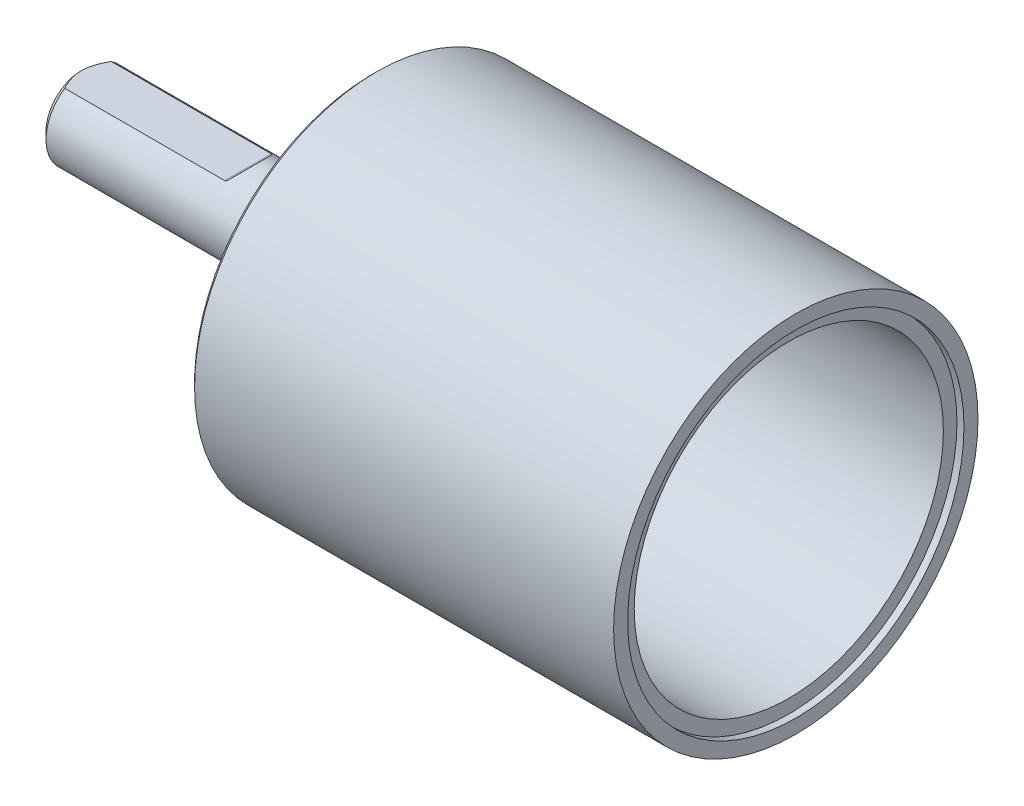
ISO-10303-21;
HEADER;
FILE_DESCRIPTION(('STEP AP214'),'2;1');
FILE_NAME('part.step','',(''),(''),'','','');
FILE_SCHEMA(('AUTOMOTIVE_DESIGN { 1 0 10303 214 1 1 1 1 }'));
ENDSEC;
DATA;
#1=APPLICATION_CONTEXT('core data for automotive mechanical design processes');
#2=APPLICATION_PROTOCOL_DEFINITION('international standard','automotive_design',2000,#1);
#3=PRODUCT_CONTEXT('',#1,'mechanical');
#4=PRODUCT('Part','Part','',(#3));
#5=PRODUCT_RELATED_PRODUCT_CATEGORY('part','',(#4));
#6=PRODUCT_DEFINITION_FORMATION('','',#4);
#7=PRODUCT_DEFINITION_CONTEXT('part definition',#1,'design');
#8=PRODUCT_DEFINITION('design','',#6,#7);
#9=PRODUCT_DEFINITION_SHAPE('','',#8);
#10=(LENGTH_UNIT() NAMED_UNIT(*) SI_UNIT(.MILLI.,.METRE.));
#11=(NAMED_UNIT(*) PLANE_ANGLE_UNIT() SI_UNIT($,.RADIAN.));
#12=(NAMED_UNIT(*) SI_UNIT($,.STERADIAN.) SOLID_ANGLE_UNIT());
#13=UNCERTAINTY_MEASURE_WITH_UNIT(LENGTH_MEASURE(1.E-05),#10,'distance_accuracy_value','');
#14=(GEOMETRIC_REPRESENTATION_CONTEXT(3) GLOBAL_UNCERTAINTY_ASSIGNED_CONTEXT((#13)) GLOBAL_UNIT_ASSIGNED_CONTEXT((#10,
#11,#12)) REPRESENTATION_CONTEXT('',''));
#15=CARTESIAN_POINT('',(0.,0.,0.));
#16=DIRECTION('',(0.,0.,1.));
#17=DIRECTION('',(1.,0.,0.));
#18=AXIS2_PLACEMENT_3D('',#15,#16,#17);
#19=CARTESIAN_POINT('',(-8.903553390593,2.75,1.760148926151));
#20=DIRECTION('',(0.,0.,-1.));
#21=DIRECTION('',(-1.,0.,0.));
#22=AXIS2_PLACEMENT_3D('',#19,#20,#21);
#23=CYLINDRICAL_SURFACE('',#22,0.25);
#24=DIRECTION('',(0.,0.,-1.));
#25=VECTOR('',#24,1.);
#26=CARTESIAN_POINT('',(-8.903553390593,2.5,-2.));
#27=LINE('',#26,#25);
#28=CARTESIAN_POINT('',(-8.903553390593,2.50000000000134,-1.65831239517366));
#29=VERTEX_POINT('',#28);
#30=CARTESIAN_POINT('',(-8.903553390593,2.49999999999998,1.65831239517774));
#31=VERTEX_POINT('',#30);
#32=EDGE_CURVE('E171',#29,#31,#27,.F.);
#33=ORIENTED_EDGE('',*,*,#32,.T.);
#34=CARTESIAN_POINT('',(-8.72677669529666,2.57322330470306,1.54224570809358));
#35=CARTESIAN_POINT('',(-8.73439985939467,2.56563624302275,1.55491918280179));
#36=CARTESIAN_POINT('',(-8.74289649208612,2.55809251140695,1.56727898662072));
#37=CARTESIAN_POINT('',(-8.76210852169711,2.5434922600164,1.59085851720834));
#38=CARTESIAN_POINT('',(-8.77285794877788,2.53644573210833,1.60205628000291));
#39=CARTESIAN_POINT('',(-8.79208402009963,2.52607708375026,1.61832921183312));
#40=CARTESIAN_POINT('',(-8.79977967658202,2.52238371853123,1.62407499191912));
#41=CARTESIAN_POINT('',(-8.81607913012841,2.51563769423967,1.63450449227761));
#42=CARTESIAN_POINT('',(-8.8246786883985,2.51258222906478,1.63919287166735));
#43=CARTESIAN_POINT('',(-8.84122182883245,2.50776865197646,1.6465456428268));
#44=CARTESIAN_POINT('',(-8.84903391565749,2.50587894599226,1.64941753453929));
#45=CARTESIAN_POINT('',(-8.8651228646061,2.50283671773988,1.65403027171102));
#46=CARTESIAN_POINT('',(-8.87339893829248,2.50168298383188,1.6557729762398));
#47=CARTESIAN_POINT('',(-8.88538609137744,2.50063457326736,1.65735542278128));
#48=CARTESIAN_POINT('',(-8.88900600754827,2.50039713273376,1.65771357331458));
#49=CARTESIAN_POINT('',(-8.89626777107055,2.50007977470023,1.65819214007039));
#50=CARTESIAN_POINT('',(-8.89990961485515,2.49999983224014,1.65831259396288));
#51=CARTESIAN_POINT('',(-8.90355339059295,2.49999999999995,1.65831239517805));
#52=B_SPLINE_CURVE_WITH_KNOTS('',3,(#34,#35,#36,#37,#38,#39,#40,#41,#42,#43,#44,#45,#46,#47,#48,
#49,#50,#51),.UNSPECIFIED.,.F.,.F.,(4,2,2,2,2,2,2,2,4),(0.,0.0500719921748423,0.100963298853683,
0.131739799136459,0.162377920913796,0.187882780738308,0.213345542491064,0.224272008855203,
0.235196743463227),.UNSPECIFIED.);
#53=CARTESIAN_POINT('',(-8.72677669529675,2.57322330470311,1.54224570809349));
#54=VERTEX_POINT('',#53);
#55=EDGE_CURVE('E21',#54,#31,#52,.T.);
#56=ORIENTED_EDGE('',*,*,#55,.F.);
#57=DIRECTION('',(0.,0.,1.));
#58=VECTOR('',#57,1.);
#59=CARTESIAN_POINT('',(-8.72677669529684,2.57322330470316,-2.));
#60=LINE('',#59,#58);
#61=CARTESIAN_POINT('',(-8.72677669529675,2.57322330470311,-1.54224570809349));
#62=VERTEX_POINT('',#61);
#63=EDGE_CURVE('E174',#54,#62,#60,.F.);
#64=ORIENTED_EDGE('',*,*,#63,.T.);
#65=CARTESIAN_POINT('',(-8.903553390593,2.5,-1.6583123951777));
#66=CARTESIAN_POINT('',(-8.89379152588564,2.49998042602031,-1.65833896948888));
#67=CARTESIAN_POINT('',(-8.88407297181455,2.50057050741547,-1.65745251620162));
#68=CARTESIAN_POINT('',(-8.8651645262979,2.50278954640737,-1.6541012176045));
#69=CARTESIAN_POINT('',(-8.85596928397319,2.50440443037962,-1.65165775290296));
#70=CARTESIAN_POINT('',(-8.83831457217026,2.5084908797649,-1.64544409868411));
#71=CARTESIAN_POINT('',(-8.82985165715079,2.51095812606447,-1.64168059665469));
#72=CARTESIAN_POINT('',(-8.81369147002877,2.51655173413125,-1.63309338244461));
#73=CARTESIAN_POINT('',(-8.80599716917573,2.51968051826178,-1.62826577095842));
#74=CARTESIAN_POINT('',(-8.78738621552995,2.52827717183096,-1.61490156190778));
#75=CARTESIAN_POINT('',(-8.77704082226438,2.53408169553418,-1.60579029414654));
#76=CARTESIAN_POINT('',(-8.75812365205936,2.54633829491558,-1.58628312619689));
#77=CARTESIAN_POINT('',(-8.74955500485647,2.55279148403187,-1.57588500980239));
#78=CARTESIAN_POINT('',(-8.73641625783792,2.56395450399927,-1.55763128899625));
#79=CARTESIAN_POINT('',(-8.73143828441519,2.568570786207,-1.55001066898698));
#80=CARTESIAN_POINT('',(-8.72677669529633,2.57322330470298,-1.54224570809377));
#81=B_SPLINE_CURVE_WITH_KNOTS('',3,(#65,#66,#67,#68,#69,#70,#71,#72,#73,#74,#75,#76,#77,#78,#79,
#80),.UNSPECIFIED.,.F.,.F.,(4,2,2,2,2,2,2,4),(0.,0.0291591243152783,0.057926224493034,
0.0865496429497565,0.115279745860272,0.159898865419011,0.20459592606371,0.235167563240899),.UNSPECIFIED.);
#82=EDGE_CURVE('E269',#29,#62,#81,.T.);
#83=ORIENTED_EDGE('',*,*,#82,.F.);
#84=EDGE_LOOP('',(#33,#56,#64,#83));
#85=FACE_BOUND('',#84,.T.);
#86=ADVANCED_FACE('F17',(#85),#23,.F.);
#87=CARTESIAN_POINT('',(-20.8,0.,0.));
#88=DIRECTION('',(1.,0.,0.));
#89=DIRECTION('',(0.,0.,-1.));
#90=AXIS2_PLACEMENT_3D('',#87,#88,#89);
#91=PLANE('',#90);
#92=CARTESIAN_POINT('',(-20.8,0.,0.));
#93=DIRECTION('',(1.,0.,0.));
#94=DIRECTION('',(0.,0.,-1.));
#95=AXIS2_PLACEMENT_3D('',#92,#93,#94);
#96=CIRCLE('',#95,2.49995526614179);
#97=CARTESIAN_POINT('',(-20.8000000000042,0.,-2.49995526615077));
#98=VERTEX_POINT('',#97);
#99=CARTESIAN_POINT('',(-20.7999847307483,2.49998747801535,3.16034668785753E-08));
#100=VERTEX_POINT('',#99);
#101=EDGE_CURVE('E175',#98,#100,#96,.T.);
#102=ORIENTED_EDGE('',*,*,#101,.F.);
#103=CARTESIAN_POINT('',(-20.8000000000084,0.,0.));
#104=DIRECTION('',(1.,0.,0.));
#105=DIRECTION('',(0.,0.,-1.));
#106=AXIS2_PLACEMENT_3D('',#103,#104,#105);
#107=CIRCLE('',#106,2.49995526615976);
#108=CARTESIAN_POINT('',(-20.8000000000042,0.,2.49995526615077));
#109=VERTEX_POINT('',#108);
#110=EDGE_CURVE('E146',#109,#98,#107,.T.);
#111=ORIENTED_EDGE('',*,*,#110,.F.);
#112=CARTESIAN_POINT('',(-20.8,0.,0.));
#113=DIRECTION('',(1.,0.,0.));
#114=DIRECTION('',(0.,0.,-1.));
#115=AXIS2_PLACEMENT_3D('',#112,#113,#114);
#116=CIRCLE('',#115,2.49995526614179);
#117=EDGE_CURVE('E274',#100,#109,#116,.T.);
#118=ORIENTED_EDGE('',*,*,#117,.F.);
#119=EDGE_LOOP('',(#102,#111,#118));
#120=FACE_BOUND('',#119,.T.);
#121=ADVANCED_FACE('F280',(#120),#91,.F.);
#122=CARTESIAN_POINT('',(-20.2999463185733,0.,0.));
#123=DIRECTION('',(1.,0.,0.));
#124=DIRECTION('',(0.,0.,-1.));
#125=AXIS2_PLACEMENT_3D('',#122,#123,#124);
#126=CONICAL_SURFACE('',#125,2.99999999981537,0.785389216524882);
#127=CARTESIAN_POINT('',(-20.2999463185208,0.,0.));
#128=DIRECTION('',(1.,0.,0.));
#129=DIRECTION('',(0.,0.,-1.));
#130=AXIS2_PLACEMENT_3D('',#127,#128,#129);
#131=CIRCLE('',#130,3.);
#132=CARTESIAN_POINT('',(-20.2999463184689,2.49999999999997,1.65831239515215));
#133=VERTEX_POINT('',#132);
#134=CARTESIAN_POINT('',(-20.2999463184663,0.,2.99999999996805));
#135=VERTEX_POINT('',#134);
#136=EDGE_CURVE('E139',#133,#135,#131,.T.);
#137=ORIENTED_EDGE('',*,*,#136,.F.);
#138=CARTESIAN_POINT('',(-20.2999463184296,2.50000000002837,1.6583123951335));
#139=CARTESIAN_POINT('',(-20.3249665062692,2.50000000001046,1.61304470716047));
#140=CARTESIAN_POINT('',(-20.3494460773636,2.50000000000286,1.56747884907225));
#141=CARTESIAN_POINT('',(-20.3971566921326,2.49999999999714,1.47571568974715));
#142=CARTESIAN_POINT('',(-20.4203880950747,2.499999999999,1.42951857506286));
#143=CARTESIAN_POINT('',(-20.4881815204448,2.50000000000201,1.28947308285205));
#144=CARTESIAN_POINT('',(-20.5306167622923,2.50000000000053,1.19457328591226));
#145=CARTESIAN_POINT('',(-20.6071132566311,2.49999999999948,1.00436545127113));
#146=CARTESIAN_POINT('',(-20.6413682061847,2.49999999999986,0.909136292805831));
#147=CARTESIAN_POINT('',(-20.701069320976,2.50000000000014,0.71597107794223));
#148=CARTESIAN_POINT('',(-20.726521785802,2.50000000000003,0.618037011768007));
#149=CARTESIAN_POINT('',(-20.7639043612629,2.49999999999997,0.434106642864585));
#150=CARTESIAN_POINT('',(-20.777246691996,2.49999999999999,0.348403325860292));
#151=CARTESIAN_POINT('',(-20.7907813183548,2.5,0.218711447797423));
#152=CARTESIAN_POINT('',(-20.7942137085033,2.5,0.175046461931179));
#153=CARTESIAN_POINT('',(-20.7988036434651,2.5,0.0875903020701174));
#154=CARTESIAN_POINT('',(-20.7999608156958,2.5,0.0437991085835761));
#155=CARTESIAN_POINT('',(-20.7999552653413,2.5,3.16030948136293E-08));
#156=B_SPLINE_CURVE_WITH_KNOTS('',3,(#138,#139,#140,#141,#142,#143,#144,#145,#146,#147,#148,
#149,#150,#151,#152,#153,#154,#155),.UNSPECIFIED.,.F.,.F.,(4,2,2,2,2,2,2,2,4),(0.,
0.155158994106816,0.310273085981901,0.621884702743622,0.925157751851407,1.22821330917488,
1.48798039005928,1.61932603888742,1.75069319468934),.UNSPECIFIED.);
#157=EDGE_CURVE('E173',#133,#100,#156,.T.);
#158=ORIENTED_EDGE('',*,*,#157,.T.);
#159=ORIENTED_EDGE('',*,*,#117,.T.);
#160=DIRECTION('',(-0.70711310755788,0.,-0.707100454758614));
#161=VECTOR('',#160,1.);
#162=CARTESIAN_POINT('',(498985.629066289,6.11098752774529E-11,499000.));
#163=LINE('',#162,#161);
#164=EDGE_CURVE('E120',#135,#109,#163,.T.);
#165=ORIENTED_EDGE('',*,*,#164,.F.);
#166=EDGE_LOOP('',(#137,#158,#159,#165));
#167=FACE_BOUND('',#166,.T.);
#168=ADVANCED_FACE('F284',(#167),#126,.T.);
#169=CARTESIAN_POINT('',(-20.2999463185733,0.,0.));
#170=DIRECTION('',(1.,0.,0.));
#171=DIRECTION('',(0.,0.,-1.));
#172=AXIS2_PLACEMENT_3D('',#169,#170,#171);
#173=CONICAL_SURFACE('',#172,2.99999999981537,0.785389216524882);
#174=CARTESIAN_POINT('',(-20.7999552653413,2.5,3.16030943864388E-08));
#175=CARTESIAN_POINT('',(-20.8000195824667,2.5,-0.0768415934476016));
#176=CARTESIAN_POINT('',(-20.7964138827622,2.5,-0.153644160526645));
#177=CARTESIAN_POINT('',(-20.782369327561,2.5,-0.306482038060874));
#178=CARTESIAN_POINT('',(-20.7719434075181,2.5,-0.382518524835492));
#179=CARTESIAN_POINT('',(-20.7449792033163,2.5,-0.532222723899795));
#180=CARTESIAN_POINT('',(-20.7285413720257,2.5,-0.605908871380052));
#181=CARTESIAN_POINT('',(-20.6902845148564,2.5,-0.751885115531154));
#182=CARTESIAN_POINT('',(-20.6684633910168,2.5,-0.824174656048432));
#183=CARTESIAN_POINT('',(-20.6221985139776,2.5,-0.961348138192857));
#184=CARTESIAN_POINT('',(-20.5981143141868,2.5,-1.026354855083));
#185=CARTESIAN_POINT('',(-20.5466518467078,2.5,-1.15504635552564));
#186=CARTESIAN_POINT('',(-20.519273437899,2.5,-1.21873108230824));
#187=CARTESIAN_POINT('',(-20.4612969582516,2.5,-1.34580785056646));
#188=CARTESIAN_POINT('',(-20.4306553902362,2.5,-1.40917989208479));
#189=CARTESIAN_POINT('',(-20.3669837090317,2.5,-1.53465896382002));
#190=CARTESIAN_POINT('',(-20.333955310789,2.5,-1.59676686200411));
#191=CARTESIAN_POINT('',(-20.2999463183996,2.5,-1.6583123951581));
#192=B_SPLINE_CURVE_WITH_KNOTS('',3,(#174,#175,#176,#177,#178,#179,#180,#181,#182,#183,#184,
#185,#186,#187,#188,#189,#190,#191),.UNSPECIFIED.,.F.,.F.,(4,2,2,2,2,2,2,2,4),(0.,
0.23037808276854,0.46032048482776,0.686584307616,0.912936448961124,1.12080912090222,
1.32869070107872,1.53980937044424,1.75077783020599),.UNSPECIFIED.);
#193=CARTESIAN_POINT('',(-20.2999463184067,2.50000000000268,-1.65831239516386));
#194=VERTEX_POINT('',#193);
#195=EDGE_CURVE('E134',#100,#194,#192,.T.);
#196=ORIENTED_EDGE('',*,*,#195,.T.);
#197=CARTESIAN_POINT('',(-20.2999463184139,0.,0.));
#198=DIRECTION('',(1.,0.,0.));
#199=DIRECTION('',(0.,0.,-1.));
#200=AXIS2_PLACEMENT_3D('',#197,#198,#199);
#201=CIRCLE('',#200,3.);
#202=CARTESIAN_POINT('',(-20.2999463184537,0.,-2.99999999995384));
#203=VERTEX_POINT('',#202);
#204=EDGE_CURVE('E127',#203,#194,#201,.T.);
#205=ORIENTED_EDGE('',*,*,#204,.F.);
#206=DIRECTION('',(-0.70711310755788,0.,0.707100454758614));
#207=VECTOR('',#206,1.);
#208=CARTESIAN_POINT('',(498985.629066289,0.,-499000.));
#209=LINE('',#208,#207);
#210=EDGE_CURVE('E131',#98,#203,#209,.F.);
#211=ORIENTED_EDGE('',*,*,#210,.F.);
#212=ORIENTED_EDGE('',*,*,#101,.T.);
#213=EDGE_LOOP('',(#196,#205,#211,#212));
#214=FACE_BOUND('',#213,.T.);
#215=ADVANCED_FACE('F129',(#214),#173,.T.);
#216=CARTESIAN_POINT('',(-8.8,2.5,-2.));
#217=DIRECTION('',(0.707106781186548,-0.707106781186548,0.));
#218=DIRECTION('',(0.707106781186548,0.707106781186548,0.));
#219=AXIS2_PLACEMENT_3D('',#216,#217,#218);
#220=PLANE('',#219);
#221=ORIENTED_EDGE('',*,*,#63,.F.);
#222=CARTESIAN_POINT('',(-11.3,0.,0.));
#223=DIRECTION('',(0.707106781186548,-0.707106781186548,0.));
#224=DIRECTION('',(0.707106781186548,0.707106781186548,0.));
#225=AXIS2_PLACEMENT_3D('',#222,#223,#224);
#226=ELLIPSE('',#225,4.24264068711928,3.);
#227=EDGE_CURVE('E156',#62,#54,#226,.T.);
#228=ORIENTED_EDGE('',*,*,#227,.F.);
#229=EDGE_LOOP('',(#221,#228));
#230=FACE_BOUND('',#229,.T.);
#231=ADVANCED_FACE('F303',(#230),#220,.F.);
#232=CARTESIAN_POINT('',(-20.8,2.5,-2.));
#233=DIRECTION('',(0.,-1.,0.));
#234=DIRECTION('',(0.,0.,-1.));
#235=AXIS2_PLACEMENT_3D('',#232,#233,#234);
#236=PLANE('',#235);
#237=ORIENTED_EDGE('',*,*,#195,.F.);
#238=ORIENTED_EDGE('',*,*,#157,.F.);
#239=DIRECTION('',(1.,0.,0.));
#240=VECTOR('',#239,1.);
#241=CARTESIAN_POINT('',(-20.80000368839,2.49999999999994,1.65831239517779));
#242=LINE('',#241,#240);
#243=EDGE_CURVE('E151',#31,#133,#242,.F.);
#244=ORIENTED_EDGE('',*,*,#243,.F.);
#245=ORIENTED_EDGE('',*,*,#32,.F.);
#246=DIRECTION('',(1.,0.,0.));
#247=VECTOR('',#246,1.);
#248=CARTESIAN_POINT('',(-20.80000368839,2.50000000000536,-1.65831239516962));
#249=LINE('',#248,#247);
#250=EDGE_CURVE('E138',#194,#29,#249,.T.);
#251=ORIENTED_EDGE('',*,*,#250,.F.);
#252=EDGE_LOOP('',(#237,#238,#244,#245,#251));
#253=FACE_BOUND('',#252,.T.);
#254=ADVANCED_FACE('F300',(#253),#236,.F.);
#255=CARTESIAN_POINT('',(-20.2999463185733,0.,0.));
#256=DIRECTION('',(1.,0.,0.));
#257=DIRECTION('',(0.,0.,-1.));
#258=AXIS2_PLACEMENT_3D('',#255,#256,#257);
#259=CONICAL_SURFACE('',#258,2.99999999981537,0.785389216498554);
#260=ORIENTED_EDGE('',*,*,#210,.T.);
#261=CARTESIAN_POINT('',(-20.2999463184139,0.,0.));
#262=DIRECTION('',(1.,0.,0.));
#263=DIRECTION('',(0.,0.,-1.));
#264=AXIS2_PLACEMENT_3D('',#261,#262,#263);
#265=CIRCLE('',#264,3.);
#266=EDGE_CURVE('E144',#135,#203,#265,.T.);
#267=ORIENTED_EDGE('',*,*,#266,.F.);
#268=ORIENTED_EDGE('',*,*,#164,.T.);
#269=ORIENTED_EDGE('',*,*,#110,.T.);
#270=EDGE_LOOP('',(#260,#267,#268,#269));
#271=FACE_BOUND('',#270,.T.);
#272=ADVANCED_FACE('F143',(#271),#259,.T.);
#273=CARTESIAN_POINT('',(-20.80000368839,0.,0.));
#274=DIRECTION('',(1.,0.,0.));
#275=DIRECTION('',(0.,0.,-1.));
#276=AXIS2_PLACEMENT_3D('',#273,#274,#275);
#277=CYLINDRICAL_SURFACE('',#276,3.);
#278=ORIENTED_EDGE('',*,*,#136,.T.);
#279=ORIENTED_EDGE('',*,*,#266,.T.);
#280=ORIENTED_EDGE('',*,*,#204,.T.);
#281=ORIENTED_EDGE('',*,*,#250,.T.);
#282=ORIENTED_EDGE('',*,*,#82,.T.);
#283=ORIENTED_EDGE('',*,*,#227,.T.);
#284=ORIENTED_EDGE('',*,*,#55,.T.);
#285=ORIENTED_EDGE('',*,*,#243,.T.);
#286=EDGE_LOOP('',(#278,#279,#280,#281,#282,#283,#284,#285));
#287=FACE_BOUND('',#286,.T.);
#288=CARTESIAN_POINT('',(-2.,0.,0.));
#289=DIRECTION('',(1.,0.,0.));
#290=DIRECTION('',(0.,0.,-1.));
#291=AXIS2_PLACEMENT_3D('',#288,#289,#290);
#292=CIRCLE('',#291,3.);
#293=CARTESIAN_POINT('',(-2.,0.,-3.));
#294=VERTEX_POINT('',#293);
#295=EDGE_CURVE('E150',#294,#294,#292,.F.);
#296=ORIENTED_EDGE('',*,*,#295,.T.);
#297=EDGE_LOOP('',(#296));
#298=FACE_BOUND('',#297,.T.);
#299=ADVANCED_FACE('F148',(#287,#298),#277,.T.);
#300=CARTESIAN_POINT('',(-2.,0.,0.));
#301=DIRECTION('',(1.,0.,0.));
#302=DIRECTION('',(0.,0.,-1.));
#303=AXIS2_PLACEMENT_3D('',#300,#301,#302);
#304=PLANE('',#303);
#305=CARTESIAN_POINT('',(-1.99999999997985,-2.35922392732846E-13,1.24373710115588E-11));
#306=DIRECTION('',(1.,0.,0.));
#307=DIRECTION('',(0.,0.,-1.));
#308=AXIS2_PLACEMENT_3D('',#305,#306,#307);
#309=CIRCLE('',#308,6.99999551084501);
#310=CARTESIAN_POINT('',(-1.99999999997985,-2.35922392732846E-13,-6.99999551083258));
#311=VERTEX_POINT('',#310);
#312=EDGE_CURVE('E323',#311,#311,#309,.T.);
#313=ORIENTED_EDGE('',*,*,#312,.F.);
#314=EDGE_LOOP('',(#313));
#315=FACE_BOUND('',#314,.T.);
#316=ORIENTED_EDGE('',*,*,#295,.F.);
#317=EDGE_LOOP('',(#316));
#318=FACE_BOUND('',#317,.T.);
#319=ADVANCED_FACE('F259',(#315,#318),#304,.F.);
#320=CARTESIAN_POINT('',(4.00000000007594,-10.,0.));
#321=DIRECTION('',(-1.,0.,0.));
#322=DIRECTION('',(0.,0.,1.));
#323=AXIS2_PLACEMENT_3D('',#320,#321,#322);
#324=CONICAL_SURFACE('',#323,1.2499999999136,1.02974425892628);
#325=CARTESIAN_POINT('',(4.0000000000191,-11.004919999999,0.74339477642944));
#326=CARTESIAN_POINT('',(4.01766833620374,-11.0085986595806,0.688935875492573));
#327=CARTESIAN_POINT('',(4.03418587820429,-11.0119016718886,0.634028248114941));
#328=CARTESIAN_POINT('',(4.06415304361389,-11.017726614232,0.523156965484276));
#329=CARTESIAN_POINT('',(4.07759252869018,-11.0202459725981,0.467190459615185));
#330=CARTESIAN_POINT('',(4.10017935739979,-11.0243884275454,0.356033101173695));
#331=CARTESIAN_POINT('',(4.10943991631456,-11.026035406716,0.300866854699357));
#332=CARTESIAN_POINT('',(4.12348176392366,-11.0285036894469,0.189954147572417));
#333=CARTESIAN_POINT('',(4.12826441408181,-11.0293252439749,0.134207868488435));
#334=CARTESIAN_POINT('',(4.13339117095832,-11.0302075901059,0.00989858411114433));
#335=CARTESIAN_POINT('',(4.13249256796179,-11.030055290253,-0.0587224588969548));
#336=CARTESIAN_POINT('',(4.12336392464542,-11.0284788009017,-0.195587978337905));
#337=CARTESIAN_POINT('',(4.11511767925287,-11.0270518000592,-0.263831286758422));
#338=CARTESIAN_POINT('',(4.09202517676174,-11.0229099304575,-0.401596339405148));
#339=CARTESIAN_POINT('',(4.07695459446496,-11.0201510584757,-0.471077216757457));
#340=CARTESIAN_POINT('',(4.0418198046082,-11.0134212890228,-0.608408616760939));
#341=CARTESIAN_POINT('',(4.02177708447369,-11.0094555906362,-0.676264811859055));
#342=CARTESIAN_POINT('',(4.0000000000191,-11.004919999999,-0.743394776429432));
#343=B_SPLINE_CURVE_WITH_KNOTS('',3,(#325,#326,#327,#328,#329,#330,#331,#332,#333,#334,#335,
#336,#337,#338,#339,#340,#341,#342),.UNSPECIFIED.,.F.,.F.,(4,2,2,2,2,2,2,2,4),(0.,
0.172171970869248,0.344903128173782,0.512622830295738,0.680291522327919,0.88573439725691,
1.09163149678277,1.30485222386368,1.517167083174),.UNSPECIFIED.);
#344=CARTESIAN_POINT('',(3.99999999999813,-11.00492,0.743394776414254));
#345=VERTEX_POINT('',#344);
#346=CARTESIAN_POINT('',(3.99999999999567,-11.0049199999995,-0.743394776421862));
#347=VERTEX_POINT('',#346);
#348=EDGE_CURVE('E241',#345,#347,#343,.T.);
#349=ORIENTED_EDGE('',*,*,#348,.T.);
#350=CARTESIAN_POINT('',(3.99999999997224,-10.,0.));
#351=DIRECTION('',(-1.,0.,0.));
#352=DIRECTION('',(0.,0.,1.));
#353=AXIS2_PLACEMENT_3D('',#350,#351,#352);
#354=CIRCLE('',#353,1.25);
#355=EDGE_CURVE('E154',#347,#345,#354,.T.);
#356=ORIENTED_EDGE('',*,*,#355,.T.);
#357=EDGE_LOOP('',(#349,#356));
#358=FACE_BOUND('',#357,.T.);
#359=ADVANCED_FACE('F253',(#358),#324,.F.);
#360=CARTESIAN_POINT('',(3.99999999996226,0.,-10.));
#361=DIRECTION('',(-1.,0.,0.));
#362=DIRECTION('',(0.,0.,1.));
#363=AXIS2_PLACEMENT_3D('',#360,#361,#362);
#364=CONICAL_SURFACE('',#363,1.24999999997954,1.02974425860797);
#365=CARTESIAN_POINT('',(3.99999999997785,0.,-10.));
#366=DIRECTION('',(-1.,0.,0.));
#367=DIRECTION('',(0.,0.,1.));
#368=AXIS2_PLACEMENT_3D('',#365,#366,#367);
#369=CIRCLE('',#368,1.25);
#370=CARTESIAN_POINT('',(3.99999999996523,0.743394776410215,-11.0049200000003));
#371=VERTEX_POINT('',#370);
#372=CARTESIAN_POINT('',(3.99999999997498,-0.743394776414254,-11.00492));
#373=VERTEX_POINT('',#372);
#374=EDGE_CURVE('E322',#371,#373,#369,.T.);
#375=ORIENTED_EDGE('',*,*,#374,.T.);
#376=CARTESIAN_POINT('',(3.99999999995312,-0.743394776404513,-11.0049200000007));
#377=CARTESIAN_POINT('',(4.01747258416943,-0.689542335163027,-11.008557770886));
#378=CARTESIAN_POINT('',(4.03381856606967,-0.635250716331415,-11.0118281221554));
#379=CARTESIAN_POINT('',(4.0635165137697,-0.525645214665434,-11.0176049317611));
#380=CARTESIAN_POINT('',(4.07685928041482,-0.470328737927038,-11.0201090512504));
#381=CARTESIAN_POINT('',(4.09962713632437,-0.359185779090317,-11.0242894616359));
#382=CARTESIAN_POINT('',(4.1090749777045,-0.303364263261464,-11.0259705712665));
#383=CARTESIAN_POINT('',(4.12337460160348,-0.191172226461041,-11.0284855244834));
#384=CARTESIAN_POINT('',(4.12823316439364,-0.134802640100712,-11.0293206181195));
#385=CARTESIAN_POINT('',(4.13110807674619,-0.0652947985663927,-11.0298144817287));
#386=CARTESIAN_POINT('',(4.13151302964951,-0.052239112169249,-11.0298840209494));
#387=CARTESIAN_POINT('',(4.132053991167,-0.0261227574020946,-11.0299767994954));
#388=CARTESIAN_POINT('',(4.13219001208389,-0.0130620892873211,-11.0300000409386));
#389=CARTESIAN_POINT('',(4.13218608085519,0.0629077077550433,-11.0299998028377));
#390=CARTESIAN_POINT('',(4.12901222950976,0.125848378700133,-11.0294595856924));
#391=CARTESIAN_POINT('',(4.11670742979469,0.251210043365858,-11.0273177624375));
#392=CARTESIAN_POINT('',(4.10756505059353,0.313629806653465,-11.0257141195785));
#393=CARTESIAN_POINT('',(4.08421711509929,0.438029195597876,-11.0214763842554));
#394=CARTESIAN_POINT('',(4.06996662404261,0.499999769923528,-11.0188331258231));
#395=CARTESIAN_POINT('',(4.03759933848088,0.622629763608445,-11.0125831468938));
#396=CARTESIAN_POINT('',(4.01949761892286,0.683293307833604,-11.0089801695734));
#397=CARTESIAN_POINT('',(3.9999999999526,0.743394776406129,-11.0049200000005));
#398=B_SPLINE_CURVE_WITH_KNOTS('',3,(#376,#377,#378,#379,#380,#381,#382,#383,#384,#385,#386,
#387,#388,#389,#390,#391,#392,#393,#394,#395,#396,#397),.UNSPECIFIED.,.F.,.F.,(4,2,2,2,2,2,2,2,
2,2,4),(0.,0.170255555855954,0.34102573182049,0.510783718234633,0.680290507469739,
0.719475099570055,0.758657899066584,0.947364318501712,1.13643320996901,1.32720783995916,
1.51724902159721),.UNSPECIFIED.);
#399=EDGE_CURVE('E427',#373,#371,#398,.T.);
#400=ORIENTED_EDGE('',*,*,#399,.T.);
#401=EDGE_LOOP('',(#375,#400));
#402=FACE_BOUND('',#401,.T.);
#403=ADVANCED_FACE('F258',(#402),#364,.F.);
#404=CARTESIAN_POINT('',(4.00000000007594,10.,0.));
#405=DIRECTION('',(-1.,0.,0.));
#406=DIRECTION('',(0.,0.,1.));
#407=AXIS2_PLACEMENT_3D('',#404,#405,#406);
#408=CONICAL_SURFACE('',#407,1.2499999999136,1.02974425892628);
#409=CARTESIAN_POINT('',(3.99999999997224,10.,0.));
#410=DIRECTION('',(-1.,0.,0.));
#411=DIRECTION('',(0.,0.,1.));
#412=AXIS2_PLACEMENT_3D('',#409,#410,#411);
#413=CIRCLE('',#412,1.25);
#414=CARTESIAN_POINT('',(3.99999999999567,11.0049199999995,0.743394776421868));
#415=VERTEX_POINT('',#414);
#416=CARTESIAN_POINT('',(3.99999999999813,11.00492,-0.743394776414254));
#417=VERTEX_POINT('',#416);
#418=EDGE_CURVE('E318',#415,#417,#413,.T.);
#419=ORIENTED_EDGE('',*,*,#418,.T.);
#420=CARTESIAN_POINT('',(4.0000000000191,11.004919999999,-0.743394776429443));
#421=CARTESIAN_POINT('',(4.01766833620374,11.0085986595806,-0.688935875492576));
#422=CARTESIAN_POINT('',(4.03418587820429,11.0119016718886,-0.634028248114944));
#423=CARTESIAN_POINT('',(4.06415304361389,11.017726614232,-0.523156965484279));
#424=CARTESIAN_POINT('',(4.07759252869018,11.0202459725981,-0.467190459615188));
#425=CARTESIAN_POINT('',(4.10017935739979,11.0243884275454,-0.356033101173697));
#426=CARTESIAN_POINT('',(4.10943991631456,11.026035406716,-0.30086685469936));
#427=CARTESIAN_POINT('',(4.12348176392366,11.0285036894469,-0.189954147572419));
#428=CARTESIAN_POINT('',(4.12826441408181,11.0293252439749,-0.134207868488438));
#429=CARTESIAN_POINT('',(4.13339117095832,11.0302075901059,-0.00989858411114615));
#430=CARTESIAN_POINT('',(4.13249256796179,11.030055290253,0.0587224588969537));
#431=CARTESIAN_POINT('',(4.12336392464542,11.0284788009017,0.195587978337905));
#432=CARTESIAN_POINT('',(4.11511767925287,11.0270518000592,0.263831286758423));
#433=CARTESIAN_POINT('',(4.09202517676174,11.0229099304575,0.40159633940515));
#434=CARTESIAN_POINT('',(4.07695459446496,11.0201510584757,0.47107721675746));
#435=CARTESIAN_POINT('',(4.0418198046082,11.0134212890228,0.608408616760942));
#436=CARTESIAN_POINT('',(4.02177708447369,11.0094555906362,0.676264811859059));
#437=CARTESIAN_POINT('',(4.0000000000191,11.004919999999,0.743394776429436));
#438=B_SPLINE_CURVE_WITH_KNOTS('',3,(#420,#421,#422,#423,#424,#425,#426,#427,#428,#429,#430,
#431,#432,#433,#434,#435,#436,#437),.UNSPECIFIED.,.F.,.F.,(4,2,2,2,2,2,2,2,4),(0.,
0.172171970869248,0.344903128173782,0.512622830295739,0.68029152232792,0.885734397256912,
1.09163149678277,1.30485222386369,1.51716708317401),.UNSPECIFIED.);
#439=EDGE_CURVE('E232',#417,#415,#438,.T.);
#440=ORIENTED_EDGE('',*,*,#439,.T.);
#441=EDGE_LOOP('',(#419,#440));
#442=FACE_BOUND('',#441,.T.);
#443=ADVANCED_FACE('F473',(#442),#408,.F.);
#444=CARTESIAN_POINT('',(2.9,0.,0.));
#445=DIRECTION('',(1.,0.,0.));
#446=DIRECTION('',(0.,0.,-1.));
#447=AXIS2_PLACEMENT_3D('',#444,#445,#446);
#448=PLANE('',#447);
#449=CARTESIAN_POINT('',(2.9,0.,10.));
#450=DIRECTION('',(-1.,0.,0.));
#451=DIRECTION('',(0.,0.,1.));
#452=AXIS2_PLACEMENT_3D('',#449,#450,#451);
#453=CIRCLE('',#452,1.25);
#454=CARTESIAN_POINT('',(2.9,0.74339477641425,11.00492));
#455=VERTEX_POINT('',#454);
#456=CARTESIAN_POINT('',(2.9,-0.743394776414273,11.00492));
#457=VERTEX_POINT('',#456);
#458=EDGE_CURVE('E316',#455,#457,#453,.T.);
#459=ORIENTED_EDGE('',*,*,#458,.T.);
#460=CARTESIAN_POINT('',(2.9,0.,0.));
#461=DIRECTION('',(1.,0.,0.));
#462=DIRECTION('',(0.,0.,-1.));
#463=AXIS2_PLACEMENT_3D('',#460,#461,#462);
#464=CIRCLE('',#463,11.03);
#465=CARTESIAN_POINT('',(2.9,-11.00492,0.743394776414251));
#466=VERTEX_POINT('',#465);
#467=EDGE_CURVE('E251',#457,#466,#464,.T.);
#468=ORIENTED_EDGE('',*,*,#467,.T.);
#469=CARTESIAN_POINT('',(2.9,-10.,0.));
#470=DIRECTION('',(-1.,0.,0.));
#471=DIRECTION('',(0.,0.,1.));
#472=AXIS2_PLACEMENT_3D('',#469,#470,#471);
#473=CIRCLE('',#472,1.25);
#474=CARTESIAN_POINT('',(2.9,-11.00492,-0.743394776414274));
#475=VERTEX_POINT('',#474);
#476=EDGE_CURVE('E314',#466,#475,#473,.T.);
#477=ORIENTED_EDGE('',*,*,#476,.T.);
#478=CARTESIAN_POINT('',(2.9,0.,0.));
#479=DIRECTION('',(1.,0.,0.));
#480=DIRECTION('',(0.,0.,-1.));
#481=AXIS2_PLACEMENT_3D('',#478,#479,#480);
#482=CIRCLE('',#481,11.03);
#483=CARTESIAN_POINT('',(2.9,-0.743394776414251,-11.00492));
#484=VERTEX_POINT('',#483);
#485=EDGE_CURVE('E250',#475,#484,#482,.T.);
#486=ORIENTED_EDGE('',*,*,#485,.T.);
#487=CARTESIAN_POINT('',(2.9,0.,-10.));
#488=DIRECTION('',(-1.,0.,0.));
#489=DIRECTION('',(0.,0.,1.));
#490=AXIS2_PLACEMENT_3D('',#487,#488,#489);
#491=CIRCLE('',#490,1.25);
#492=CARTESIAN_POINT('',(2.9,0.743394776414277,-11.00492));
#493=VERTEX_POINT('',#492);
#494=EDGE_CURVE('E321',#484,#493,#491,.T.);
#495=ORIENTED_EDGE('',*,*,#494,.T.);
#496=CARTESIAN_POINT('',(2.9,0.,0.));
#497=DIRECTION('',(1.,0.,0.));
#498=DIRECTION('',(0.,0.,-1.));
#499=AXIS2_PLACEMENT_3D('',#496,#497,#498);
#500=CIRCLE('',#499,11.03);
#501=CARTESIAN_POINT('',(2.9,11.00492,-0.74339477641425));
#502=VERTEX_POINT('',#501);
#503=EDGE_CURVE('E431',#493,#502,#500,.T.);
#504=ORIENTED_EDGE('',*,*,#503,.T.);
#505=CARTESIAN_POINT('',(2.9,10.,0.));
#506=DIRECTION('',(-1.,0.,0.));
#507=DIRECTION('',(0.,0.,1.));
#508=AXIS2_PLACEMENT_3D('',#505,#506,#507);
#509=CIRCLE('',#508,1.25);
#510=CARTESIAN_POINT('',(2.9,11.00492,0.743394776414277));
#511=VERTEX_POINT('',#510);
#512=EDGE_CURVE('E319',#502,#511,#509,.T.);
#513=ORIENTED_EDGE('',*,*,#512,.T.);
#514=CARTESIAN_POINT('',(2.9,0.,0.));
#515=DIRECTION('',(1.,0.,0.));
#516=DIRECTION('',(0.,0.,-1.));
#517=AXIS2_PLACEMENT_3D('',#514,#515,#516);
#518=CIRCLE('',#517,11.03);
#519=EDGE_CURVE('E214',#511,#455,#518,.T.);
#520=ORIENTED_EDGE('',*,*,#519,.T.);
#521=EDGE_LOOP('',(#459,#468,#477,#486,#495,#504,#513,#520));
#522=FACE_BOUND('',#521,.T.);
#523=ADVANCED_FACE('F458',(#522),#448,.T.);
#524=CARTESIAN_POINT('',(3.99999999996226,0.,10.));
#525=DIRECTION('',(-1.,0.,0.));
#526=DIRECTION('',(0.,0.,1.));
#527=AXIS2_PLACEMENT_3D('',#524,#525,#526);
#528=CONICAL_SURFACE('',#527,1.25000000001819,1.02974425868329);
#529=CARTESIAN_POINT('',(3.99999999997414,0.743394776411309,11.0049200000002));
#530=CARTESIAN_POINT('',(4.01747258418747,0.689542335170163,11.0085577708856));
#531=CARTESIAN_POINT('',(4.0338185660849,0.635250716339026,11.0118281221549));
#532=CARTESIAN_POINT('',(4.06351651377984,0.525645214674343,11.0176049317607));
#533=CARTESIAN_POINT('',(4.07685928042268,0.470328737936771,11.02010905125));
#534=CARTESIAN_POINT('',(4.09962713632849,0.359185779101848,11.0242894616356));
#535=CARTESIAN_POINT('',(4.10907497770715,0.303364263273964,11.0259705712662));
#536=CARTESIAN_POINT('',(4.12337460160417,0.19117222647565,11.0284855244831));
#537=CARTESIAN_POINT('',(4.12823316439383,0.134802640116461,11.0293206181193));
#538=CARTESIAN_POINT('',(4.13110807674658,0.0652947985804752,11.0298144817286));
#539=CARTESIAN_POINT('',(4.13151302965001,0.052239112180516,11.0298840209494));
#540=CARTESIAN_POINT('',(4.13205399116764,0.0261227574077287,11.0299767994954));
#541=CARTESIAN_POINT('',(4.13219001208457,0.013062089290138,11.0300000409386));
#542=CARTESIAN_POINT('',(4.13218608085587,-0.0629077077553268,11.0299998028377));
#543=CARTESIAN_POINT('',(4.12901222951095,-0.125848378700687,11.0294595856923));
#544=CARTESIAN_POINT('',(4.11670742979785,-0.251210043367116,11.0273177624374));
#545=CARTESIAN_POINT('',(4.10756505059815,-0.313629806655156,11.0257141195785));
#546=CARTESIAN_POINT('',(4.08421711510758,-0.438029195600559,11.0214763842553));
#547=CARTESIAN_POINT('',(4.06996662405313,-0.499999769926775,11.0188331258229));
#548=CARTESIAN_POINT('',(4.03759933849635,-0.622629763613203,11.0125831468935));
#549=CARTESIAN_POINT('',(4.01949761894104,-0.683293307839305,11.008980169573));
#550=CARTESIAN_POINT('',(3.99999999997362,-0.743394776412918,11.0049200000001));
#551=B_SPLINE_CURVE_WITH_KNOTS('',3,(#529,#530,#531,#532,#533,#534,#535,#536,#537,#538,#539,
#540,#541,#542,#543,#544,#545,#546,#547,#548,#549,#550),.UNSPECIFIED.,.F.,.F.,(4,2,2,2,2,2,2,2,
2,2,4),(0.,0.170255555852212,0.341025731812782,0.510783718223389,0.680290507455066,
0.719475099563834,0.758657899068814,0.947364318504793,1.13643320997282,1.32720783996317,
1.51724902160167),.UNSPECIFIED.);
#552=CARTESIAN_POINT('',(3.99999999998659,0.743394776414254,11.00492));
#553=VERTEX_POINT('',#552);
#554=CARTESIAN_POINT('',(3.99999999997574,-0.743394776413606,11.00492));
#555=VERTEX_POINT('',#554);
#556=EDGE_CURVE('E205',#553,#555,#551,.T.);
#557=ORIENTED_EDGE('',*,*,#556,.T.);
#558=CARTESIAN_POINT('',(4.,0.,10.));
#559=DIRECTION('',(-1.,0.,0.));
#560=DIRECTION('',(0.,0.,1.));
#561=AXIS2_PLACEMENT_3D('',#558,#559,#560);
#562=CIRCLE('',#561,1.25);
#563=EDGE_CURVE('E39',#555,#553,#562,.T.);
#564=ORIENTED_EDGE('',*,*,#563,.T.);
#565=EDGE_LOOP('',(#557,#564));
#566=FACE_BOUND('',#565,.T.);
#567=ADVANCED_FACE('F216',(#566),#528,.F.);
#568=CARTESIAN_POINT('',(4.988629562474,-10.,0.));
#569=DIRECTION('',(-1.,0.,0.));
#570=DIRECTION('',(0.,0.,1.));
#571=AXIS2_PLACEMENT_3D('',#568,#569,#570);
#572=CYLINDRICAL_SURFACE('',#571,1.25);
#573=ORIENTED_EDGE('',*,*,#476,.F.);
#574=DIRECTION('',(1.,0.,0.));
#575=VECTOR('',#574,1.);
#576=CARTESIAN_POINT('',(-20.80000368839,-11.00492,0.743394776414268));
#577=LINE('',#576,#575);
#578=EDGE_CURVE('E249',#466,#345,#577,.T.);
#579=ORIENTED_EDGE('',*,*,#578,.T.);
#580=ORIENTED_EDGE('',*,*,#355,.F.);
#581=DIRECTION('',(1.,0.,0.));
#582=VECTOR('',#581,1.);
#583=CARTESIAN_POINT('',(-20.80000368839,-11.00492,-0.743394776414293));
#584=LINE('',#583,#582);
#585=EDGE_CURVE('E248',#347,#475,#584,.F.);
#586=ORIENTED_EDGE('',*,*,#585,.T.);
#587=EDGE_LOOP('',(#573,#579,#580,#586));
#588=FACE_BOUND('',#587,.T.);
#589=CARTESIAN_POINT('',(0.0500000001011358,-10.,0.));
#590=DIRECTION('',(-1.,0.,0.));
#591=DIRECTION('',(0.,0.,1.));
#592=AXIS2_PLACEMENT_3D('',#589,#590,#591);
#593=CIRCLE('',#592,1.24999999997044);
#594=CARTESIAN_POINT('',(0.0500000001011358,-10.,1.24999999997044));
#595=VERTEX_POINT('',#594);
#596=EDGE_CURVE('E212',#595,#595,#593,.T.);
#597=ORIENTED_EDGE('',*,*,#596,.T.);
#598=EDGE_LOOP('',(#597));
#599=FACE_BOUND('',#598,.T.);
#600=ADVANCED_FACE('F467',(#588,#599),#572,.F.);
#601=CARTESIAN_POINT('',(4.988629562474,0.,10.));
#602=DIRECTION('',(-1.,0.,0.));
#603=DIRECTION('',(0.,0.,1.));
#604=AXIS2_PLACEMENT_3D('',#601,#602,#603);
#605=CYLINDRICAL_SURFACE('',#604,1.25);
#606=ORIENTED_EDGE('',*,*,#563,.F.);
#607=DIRECTION('',(1.,0.,0.));
#608=VECTOR('',#607,1.);
#609=CARTESIAN_POINT('',(-20.80000368839,-0.743394776414294,11.00492));
#610=LINE('',#609,#608);
#611=EDGE_CURVE('E325',#555,#457,#610,.F.);
#612=ORIENTED_EDGE('',*,*,#611,.T.);
#613=ORIENTED_EDGE('',*,*,#458,.F.);
#614=DIRECTION('',(1.,0.,0.));
#615=VECTOR('',#614,1.);
#616=CARTESIAN_POINT('',(-20.80000368839,0.743394776414267,11.00492));
#617=LINE('',#616,#615);
#618=EDGE_CURVE('E213',#455,#553,#617,.T.);
#619=ORIENTED_EDGE('',*,*,#618,.T.);
#620=EDGE_LOOP('',(#606,#612,#613,#619));
#621=FACE_BOUND('',#620,.T.);
#622=CARTESIAN_POINT('',(0.0500000000442924,0.,10.));
#623=DIRECTION('',(-1.,0.,0.));
#624=DIRECTION('',(0.,0.,1.));
#625=AXIS2_PLACEMENT_3D('',#622,#623,#624);
#626=CIRCLE('',#625,1.24999999996135);
#627=CARTESIAN_POINT('',(0.0500000000442924,0.,11.2499999999613));
#628=VERTEX_POINT('',#627);
#629=EDGE_CURVE('E399',#628,#628,#626,.T.);
#630=ORIENTED_EDGE('',*,*,#629,.T.);
#631=EDGE_LOOP('',(#630));
#632=FACE_BOUND('',#631,.T.);
#633=ADVANCED_FACE('F462',(#621,#632),#605,.F.);
#634=CARTESIAN_POINT('',(4.988629562474,10.,0.));
#635=DIRECTION('',(-1.,0.,0.));
#636=DIRECTION('',(0.,0.,1.));
#637=AXIS2_PLACEMENT_3D('',#634,#635,#636);
#638=CYLINDRICAL_SURFACE('',#637,1.25);
#639=DIRECTION('',(1.,0.,0.));
#640=VECTOR('',#639,1.);
#641=CARTESIAN_POINT('',(-20.80000368839,11.00492,0.743394776414299));
#642=LINE('',#641,#640);
#643=EDGE_CURVE('E435',#415,#511,#642,.F.);
#644=ORIENTED_EDGE('',*,*,#643,.T.);
#645=ORIENTED_EDGE('',*,*,#512,.F.);
#646=DIRECTION('',(1.,0.,0.));
#647=VECTOR('',#646,1.);
#648=CARTESIAN_POINT('',(-20.80000368839,11.00492,-0.743394776414267));
#649=LINE('',#648,#647);
#650=EDGE_CURVE('E432',#502,#417,#649,.T.);
#651=ORIENTED_EDGE('',*,*,#650,.T.);
#652=ORIENTED_EDGE('',*,*,#418,.F.);
#653=EDGE_LOOP('',(#644,#645,#651,#652));
#654=FACE_BOUND('',#653,.T.);
#655=CARTESIAN_POINT('',(0.0500000001011358,10.,0.));
#656=DIRECTION('',(-1.,0.,0.));
#657=DIRECTION('',(0.,0.,1.));
#658=AXIS2_PLACEMENT_3D('',#655,#656,#657);
#659=CIRCLE('',#658,1.24999999997044);
#660=CARTESIAN_POINT('',(0.0500000001011358,10.,1.24999999997044));
#661=VERTEX_POINT('',#660);
#662=EDGE_CURVE('E406',#661,#661,#659,.T.);
#663=ORIENTED_EDGE('',*,*,#662,.T.);
#664=EDGE_LOOP('',(#663));
#665=FACE_BOUND('',#664,.T.);
#666=ADVANCED_FACE('F486',(#654,#665),#638,.F.);
#667=CARTESIAN_POINT('',(4.988629562474,0.,-10.));
#668=DIRECTION('',(-1.,0.,0.));
#669=DIRECTION('',(0.,0.,1.));
#670=AXIS2_PLACEMENT_3D('',#667,#668,#669);
#671=CYLINDRICAL_SURFACE('',#670,1.25);
#672=ORIENTED_EDGE('',*,*,#494,.F.);
#673=DIRECTION('',(1.,0.,0.));
#674=VECTOR('',#673,1.);
#675=CARTESIAN_POINT('',(-20.80000368839,-0.743394776414268,-11.00492));
#676=LINE('',#675,#674);
#677=EDGE_CURVE('E424',#484,#373,#676,.T.);
#678=ORIENTED_EDGE('',*,*,#677,.T.);
#679=ORIENTED_EDGE('',*,*,#374,.F.);
#680=DIRECTION('',(1.,0.,0.));
#681=VECTOR('',#680,1.);
#682=CARTESIAN_POINT('',(-20.80000368839,0.7433947764143,-11.00492));
#683=LINE('',#682,#681);
#684=EDGE_CURVE('E428',#371,#493,#683,.F.);
#685=ORIENTED_EDGE('',*,*,#684,.T.);
#686=EDGE_LOOP('',(#672,#678,#679,#685));
#687=FACE_BOUND('',#686,.T.);
#688=CARTESIAN_POINT('',(0.0500000000442924,0.,-10.));
#689=DIRECTION('',(-1.,0.,0.));
#690=DIRECTION('',(0.,0.,1.));
#691=AXIS2_PLACEMENT_3D('',#688,#689,#690);
#692=CIRCLE('',#691,1.24999999997954);
#693=CARTESIAN_POINT('',(0.0500000000442924,0.,-8.75000000002046));
#694=VERTEX_POINT('',#693);
#695=EDGE_CURVE('E409',#694,#694,#692,.T.);
#696=ORIENTED_EDGE('',*,*,#695,.T.);
#697=EDGE_LOOP('',(#696));
#698=FACE_BOUND('',#697,.T.);
#699=ADVANCED_FACE('F228',(#687,#698),#671,.F.);
#700=CARTESIAN_POINT('',(-1.5,-2.35922392732846E-13,1.24373710115588E-11));
#701=DIRECTION('',(1.,0.,0.));
#702=DIRECTION('',(0.,0.,-1.));
#703=AXIS2_PLACEMENT_3D('',#700,#701,#702);
#704=TOROIDAL_SURFACE('',#703,7.,0.500000000000001);
#705=ORIENTED_EDGE('',*,*,#312,.T.);
#706=EDGE_LOOP('',(#705));
#707=FACE_BOUND('',#706,.T.);
#708=CARTESIAN_POINT('',(-1.5,0.,0.));
#709=DIRECTION('',(1.,0.,0.));
#710=DIRECTION('',(0.,0.,-1.));
#711=AXIS2_PLACEMENT_3D('',#708,#709,#710);
#712=CIRCLE('',#711,7.5);
#713=CARTESIAN_POINT('',(-1.5,0.,-7.5));
#714=VERTEX_POINT('',#713);
#715=EDGE_CURVE('E204',#714,#714,#712,.T.);
#716=ORIENTED_EDGE('',*,*,#715,.F.);
#717=EDGE_LOOP('',(#716));
#718=FACE_BOUND('',#717,.T.);
#719=ADVANCED_FACE('F19',(#707,#718),#704,.T.);
#720=CARTESIAN_POINT('',(-20.80000368839,0.,0.));
#721=DIRECTION('',(1.,0.,0.));
#722=DIRECTION('',(0.,0.,-1.));
#723=AXIS2_PLACEMENT_3D('',#720,#721,#722);
#724=CYLINDRICAL_SURFACE('',#723,11.03);
#725=ORIENTED_EDGE('',*,*,#399,.F.);
#726=ORIENTED_EDGE('',*,*,#677,.F.);
#727=ORIENTED_EDGE('',*,*,#485,.F.);
#728=ORIENTED_EDGE('',*,*,#585,.F.);
#729=ORIENTED_EDGE('',*,*,#348,.F.);
#730=ORIENTED_EDGE('',*,*,#578,.F.);
#731=ORIENTED_EDGE('',*,*,#467,.F.);
#732=ORIENTED_EDGE('',*,*,#611,.F.);
#733=ORIENTED_EDGE('',*,*,#556,.F.);
#734=ORIENTED_EDGE('',*,*,#618,.F.);
#735=ORIENTED_EDGE('',*,*,#519,.F.);
#736=ORIENTED_EDGE('',*,*,#643,.F.);
#737=ORIENTED_EDGE('',*,*,#439,.F.);
#738=ORIENTED_EDGE('',*,*,#650,.F.);
#739=ORIENTED_EDGE('',*,*,#503,.F.);
#740=ORIENTED_EDGE('',*,*,#684,.F.);
#741=EDGE_LOOP('',(#725,#726,#727,#728,#729,#730,#731,#732,#733,#734,#735,#736,#737,#738,#739,#740));
#742=FACE_BOUND('',#741,.T.);
#743=CARTESIAN_POINT('',(29.7,0.,0.));
#744=DIRECTION('',(1.,0.,0.));
#745=DIRECTION('',(0.,0.,-1.));
#746=AXIS2_PLACEMENT_3D('',#743,#744,#745);
#747=CIRCLE('',#746,11.03);
#748=CARTESIAN_POINT('',(29.7,0.,-11.03));
#749=VERTEX_POINT('',#748);
#750=EDGE_CURVE('E201',#749,#749,#747,.F.);
#751=ORIENTED_EDGE('',*,*,#750,.F.);
#752=EDGE_LOOP('',(#751));
#753=FACE_BOUND('',#752,.T.);
#754=ADVANCED_FACE('F220',(#742,#753),#724,.F.);
#755=CARTESIAN_POINT('',(0.,-10.,0.));
#756=DIRECTION('',(-1.,0.,0.));
#757=DIRECTION('',(0.,0.,1.));
#758=AXIS2_PLACEMENT_3D('',#755,#756,#757);
#759=CONICAL_SURFACE('',#758,1.30000000001473,0.785398162829014);
#760=ORIENTED_EDGE('',*,*,#596,.F.);
#761=EDGE_LOOP('',(#760));
#762=FACE_BOUND('',#761,.T.);
#763=CARTESIAN_POINT('',(0.,-10.,0.));
#764=DIRECTION('',(-1.,0.,0.));
#765=DIRECTION('',(0.,0.,1.));
#766=AXIS2_PLACEMENT_3D('',#763,#764,#765);
#767=CIRCLE('',#766,1.30000000001473);
#768=CARTESIAN_POINT('',(0.,-10.,1.30000000001473));
#769=VERTEX_POINT('',#768);
#770=EDGE_CURVE('E198',#769,#769,#767,.T.);
#771=ORIENTED_EDGE('',*,*,#770,.T.);
#772=EDGE_LOOP('',(#771));
#773=FACE_BOUND('',#772,.T.);
#774=ADVANCED_FACE('F225',(#762,#773),#759,.F.);
#775=CARTESIAN_POINT('',(0.,0.,10.));
#776=DIRECTION('',(-1.,0.,0.));
#777=DIRECTION('',(0.,0.,1.));
#778=AXIS2_PLACEMENT_3D('',#775,#776,#777);
#779=CONICAL_SURFACE('',#778,1.30000000000564,0.785398163397448);
#780=ORIENTED_EDGE('',*,*,#629,.F.);
#781=EDGE_LOOP('',(#780));
#782=FACE_BOUND('',#781,.T.);
#783=CARTESIAN_POINT('',(0.,0.,10.));
#784=DIRECTION('',(-1.,0.,0.));
#785=DIRECTION('',(0.,0.,1.));
#786=AXIS2_PLACEMENT_3D('',#783,#784,#785);
#787=CIRCLE('',#786,1.30000000000564);
#788=CARTESIAN_POINT('',(0.,0.,11.3000000000056));
#789=VERTEX_POINT('',#788);
#790=EDGE_CURVE('E195',#789,#789,#787,.T.);
#791=ORIENTED_EDGE('',*,*,#790,.T.);
#792=EDGE_LOOP('',(#791));
#793=FACE_BOUND('',#792,.T.);
#794=ADVANCED_FACE('F388',(#782,#793),#779,.F.);
#795=CARTESIAN_POINT('',(0.,10.,0.));
#796=DIRECTION('',(-1.,0.,0.));
#797=DIRECTION('',(0.,0.,1.));
#798=AXIS2_PLACEMENT_3D('',#795,#796,#797);
#799=CONICAL_SURFACE('',#798,1.30000000001473,0.785398162829014);
#800=ORIENTED_EDGE('',*,*,#662,.F.);
#801=EDGE_LOOP('',(#800));
#802=FACE_BOUND('',#801,.T.);
#803=CARTESIAN_POINT('',(0.,10.,0.));
#804=DIRECTION('',(-1.,0.,0.));
#805=DIRECTION('',(0.,0.,1.));
#806=AXIS2_PLACEMENT_3D('',#803,#804,#805);
#807=CIRCLE('',#806,1.30000000001473);
#808=CARTESIAN_POINT('',(0.,10.,1.30000000001473));
#809=VERTEX_POINT('',#808);
#810=EDGE_CURVE('E192',#809,#809,#807,.T.);
#811=ORIENTED_EDGE('',*,*,#810,.T.);
#812=EDGE_LOOP('',(#811));
#813=FACE_BOUND('',#812,.T.);
#814=ADVANCED_FACE('F385',(#802,#813),#799,.F.);
#815=CARTESIAN_POINT('',(0.,0.,-10.));
#816=DIRECTION('',(-1.,0.,0.));
#817=DIRECTION('',(0.,0.,1.));
#818=AXIS2_PLACEMENT_3D('',#815,#816,#817);
#819=CONICAL_SURFACE('',#818,1.30000000002383,0.785398163397448);
#820=ORIENTED_EDGE('',*,*,#695,.F.);
#821=EDGE_LOOP('',(#820));
#822=FACE_BOUND('',#821,.T.);
#823=CARTESIAN_POINT('',(0.,0.,-10.));
#824=DIRECTION('',(-1.,0.,0.));
#825=DIRECTION('',(0.,0.,1.));
#826=AXIS2_PLACEMENT_3D('',#823,#824,#825);
#827=CIRCLE('',#826,1.30000000002383);
#828=CARTESIAN_POINT('',(0.,0.,-8.69999999997617));
#829=VERTEX_POINT('',#828);
#830=EDGE_CURVE('E189',#829,#829,#827,.T.);
#831=ORIENTED_EDGE('',*,*,#830,.T.);
#832=EDGE_LOOP('',(#831));
#833=FACE_BOUND('',#832,.T.);
#834=ADVANCED_FACE('F381',(#822,#833),#819,.F.);
#835=CARTESIAN_POINT('',(-20.80000368839,0.,0.));
#836=DIRECTION('',(1.,0.,0.));
#837=DIRECTION('',(0.,0.,-1.));
#838=AXIS2_PLACEMENT_3D('',#835,#836,#837);
#839=CYLINDRICAL_SURFACE('',#838,7.5);
#840=ORIENTED_EDGE('',*,*,#715,.T.);
#841=EDGE_LOOP('',(#840));
#842=FACE_BOUND('',#841,.T.);
#843=CARTESIAN_POINT('',(0.,0.,0.));
#844=DIRECTION('',(1.,0.,0.));
#845=DIRECTION('',(0.,0.,-1.));
#846=AXIS2_PLACEMENT_3D('',#843,#844,#845);
#847=CIRCLE('',#846,7.5);
#848=CARTESIAN_POINT('',(0.,0.,-7.5));
#849=VERTEX_POINT('',#848);
#850=EDGE_CURVE('E186',#849,#849,#847,.F.);
#851=ORIENTED_EDGE('',*,*,#850,.T.);
#852=EDGE_LOOP('',(#851));
#853=FACE_BOUND('',#852,.T.);
#854=ADVANCED_FACE('F377',(#842,#853),#839,.T.);
#855=CARTESIAN_POINT('',(29.7,0.,0.));
#856=DIRECTION('',(1.,0.,0.));
#857=DIRECTION('',(0.,0.,-1.));
#858=AXIS2_PLACEMENT_3D('',#855,#856,#857);
#859=PLANE('',#858);
#860=CARTESIAN_POINT('',(29.7,0.,0.));
#861=DIRECTION('',(1.,0.,0.));
#862=DIRECTION('',(0.,0.,-1.));
#863=AXIS2_PLACEMENT_3D('',#860,#861,#862);
#864=CIRCLE('',#863,12.);
#865=CARTESIAN_POINT('',(29.7,0.,-12.));
#866=VERTEX_POINT('',#865);
#867=EDGE_CURVE('E183',#866,#866,#864,.T.);
#868=ORIENTED_EDGE('',*,*,#867,.T.);
#869=EDGE_LOOP('',(#868));
#870=FACE_BOUND('',#869,.T.);
#871=ORIENTED_EDGE('',*,*,#750,.T.);
#872=EDGE_LOOP('',(#871));
#873=FACE_BOUND('',#872,.T.);
#874=ADVANCED_FACE('F373',(#870,#873),#859,.T.);
#875=CARTESIAN_POINT('',(0.,0.,0.));
#876=DIRECTION('',(1.,0.,0.));
#877=DIRECTION('',(0.,0.,-1.));
#878=AXIS2_PLACEMENT_3D('',#875,#876,#877);
#879=PLANE('',#878);
#880=CARTESIAN_POINT('',(0.,0.,0.));
#881=DIRECTION('',(1.,0.,0.));
#882=DIRECTION('',(0.,0.,-1.));
#883=AXIS2_PLACEMENT_3D('',#880,#881,#882);
#884=CIRCLE('',#883,12.7000052213982);
#885=CARTESIAN_POINT('',(0.,0.,-12.7000052213982));
#886=VERTEX_POINT('',#885);
#887=EDGE_CURVE('E180',#886,#886,#884,.T.);
#888=ORIENTED_EDGE('',*,*,#887,.F.);
#889=EDGE_LOOP('',(#888));
#890=FACE_BOUND('',#889,.T.);
#891=ORIENTED_EDGE('',*,*,#850,.F.);
#892=EDGE_LOOP('',(#891));
#893=FACE_BOUND('',#892,.T.);
#894=ORIENTED_EDGE('',*,*,#830,.F.);
#895=EDGE_LOOP('',(#894));
#896=FACE_BOUND('',#895,.T.);
#897=ORIENTED_EDGE('',*,*,#810,.F.);
#898=EDGE_LOOP('',(#897));
#899=FACE_BOUND('',#898,.T.);
#900=ORIENTED_EDGE('',*,*,#790,.F.);
#901=EDGE_LOOP('',(#900));
#902=FACE_BOUND('',#901,.T.);
#903=ORIENTED_EDGE('',*,*,#770,.F.);
#904=EDGE_LOOP('',(#903));
#905=FACE_BOUND('',#904,.T.);
#906=ADVANCED_FACE('F369',(#890,#893,#896,#899,#902,#905),#879,.F.);
#907=CARTESIAN_POINT('',(-20.80000368839,0.,0.));
#908=DIRECTION('',(1.,0.,0.));
#909=DIRECTION('',(0.,0.,-1.));
#910=AXIS2_PLACEMENT_3D('',#907,#908,#909);
#911=CYLINDRICAL_SURFACE('',#910,12.);
#912=ORIENTED_EDGE('',*,*,#867,.F.);
#913=EDGE_LOOP('',(#912));
#914=FACE_BOUND('',#913,.T.);
#915=CARTESIAN_POINT('',(30.2,0.,0.));
#916=DIRECTION('',(1.,0.,0.));
#917=DIRECTION('',(0.,0.,-1.));
#918=AXIS2_PLACEMENT_3D('',#915,#916,#917);
#919=CIRCLE('',#918,12.);
#920=CARTESIAN_POINT('',(30.2,0.,-12.));
#921=VERTEX_POINT('',#920);
#922=EDGE_CURVE('E177',#921,#921,#919,.F.);
#923=ORIENTED_EDGE('',*,*,#922,.F.);
#924=EDGE_LOOP('',(#923));
#925=FACE_BOUND('',#924,.T.);
#926=ADVANCED_FACE('F365',(#914,#925),#911,.F.);
#927=CARTESIAN_POINT('',(0.299994655263897,0.,0.));
#928=DIRECTION('',(1.,0.,0.));
#929=DIRECTION('',(0.,0.,-1.));
#930=AXIS2_PLACEMENT_3D('',#927,#928,#929);
#931=CONICAL_SURFACE('',#930,13.,0.785398368964274);
#932=CARTESIAN_POINT('',(0.299994655263897,0.,0.));
#933=DIRECTION('',(1.,0.,0.));
#934=DIRECTION('',(0.,0.,-1.));
#935=AXIS2_PLACEMENT_3D('',#932,#933,#934);
#936=CIRCLE('',#935,13.);
#937=CARTESIAN_POINT('',(0.299994655263897,0.,-13.));
#938=VERTEX_POINT('',#937);
#939=EDGE_CURVE('E31',#938,#938,#936,.T.);
#940=ORIENTED_EDGE('',*,*,#939,.F.);
#941=EDGE_LOOP('',(#940));
#942=FACE_BOUND('',#941,.T.);
#943=ORIENTED_EDGE('',*,*,#887,.T.);
#944=EDGE_LOOP('',(#943));
#945=FACE_BOUND('',#944,.T.);
#946=ADVANCED_FACE('F358',(#942,#945),#931,.T.);
#947=CARTESIAN_POINT('',(30.2,0.,0.));
#948=DIRECTION('',(1.,0.,0.));
#949=DIRECTION('',(0.,0.,-1.));
#950=AXIS2_PLACEMENT_3D('',#947,#948,#949);
#951=PLANE('',#950);
#952=ORIENTED_EDGE('',*,*,#922,.T.);
#953=EDGE_LOOP('',(#952));
#954=FACE_BOUND('',#953,.T.);
#955=CARTESIAN_POINT('',(30.2,0.,0.));
#956=DIRECTION('',(1.,0.,0.));
#957=DIRECTION('',(0.,0.,-1.));
#958=AXIS2_PLACEMENT_3D('',#955,#956,#957);
#959=CIRCLE('',#958,13.);
#960=CARTESIAN_POINT('',(30.2,0.,-13.));
#961=VERTEX_POINT('',#960);
#962=EDGE_CURVE('E11',#961,#961,#959,.F.);
#963=ORIENTED_EDGE('',*,*,#962,.F.);
#964=EDGE_LOOP('',(#963));
#965=FACE_BOUND('',#964,.T.);
#966=ADVANCED_FACE('F352',(#954,#965),#951,.T.);
#967=CARTESIAN_POINT('',(-20.80000368839,0.,0.));
#968=DIRECTION('',(1.,0.,0.));
#969=DIRECTION('',(0.,0.,-1.));
#970=AXIS2_PLACEMENT_3D('',#967,#968,#969);
#971=CYLINDRICAL_SURFACE('',#970,13.);
#972=ORIENTED_EDGE('',*,*,#962,.T.);
#973=EDGE_LOOP('',(#972));
#974=FACE_BOUND('',#973,.T.);
#975=ORIENTED_EDGE('',*,*,#939,.T.);
#976=EDGE_LOOP('',(#975));
#977=FACE_BOUND('',#976,.T.);
#978=ADVANCED_FACE('F350',(#974,#977),#971,.T.);
#979=CLOSED_SHELL('',(#86,#121,#168,#215,#231,#254,#272,#299,#319,#359,#403,#443,#523,#567,#600,
#633,#666,#699,#719,#754,#774,#794,#814,#834,#854,#874,#906,#926,#946,#966,#978));
#980=MANIFOLD_SOLID_BREP('B1',#979);
#981=ADVANCED_BREP_SHAPE_REPRESENTATION('',(#18,#980),#14);
#982=SHAPE_DEFINITION_REPRESENTATION(#9,#981);
ENDSEC;
END-ISO-10303-21;
